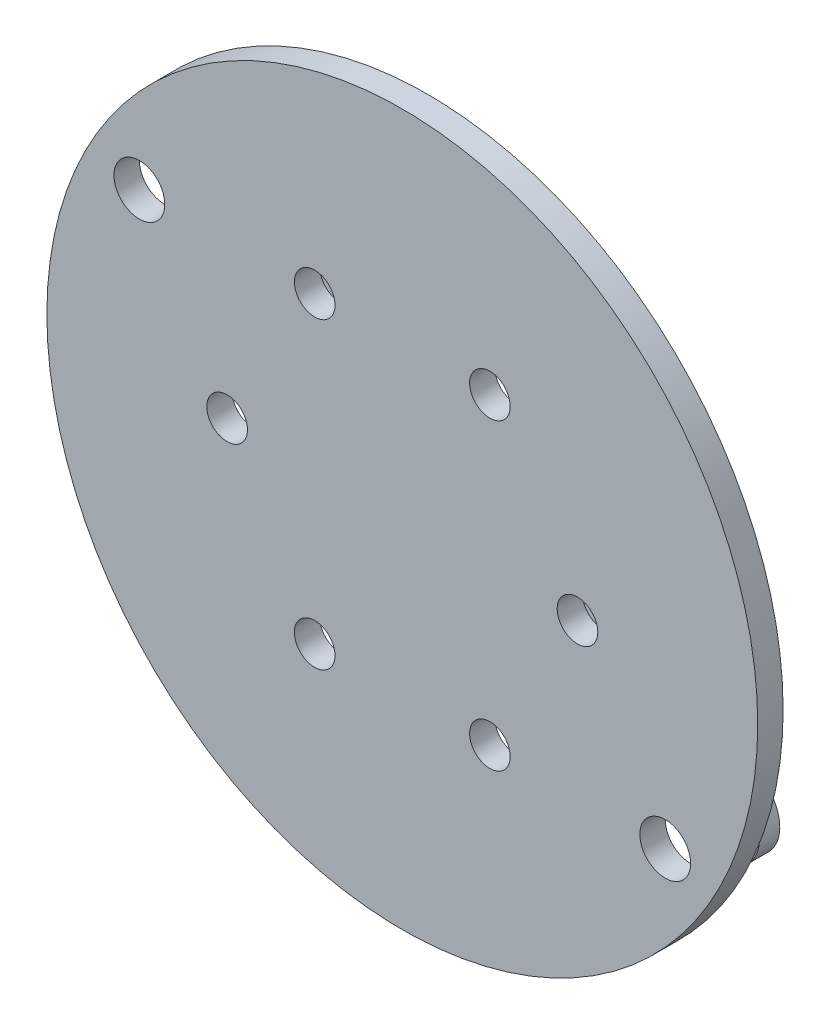
ISO-10303-21;
HEADER;
FILE_DESCRIPTION(('STEP AP214'),'2;1');
FILE_NAME('part.step','',(''),(''),'','','');
FILE_SCHEMA(('AUTOMOTIVE_DESIGN { 1 0 10303 214 1 1 1 1 }'));
ENDSEC;
DATA;
#1=APPLICATION_CONTEXT('core data for automotive mechanical design processes');
#2=APPLICATION_PROTOCOL_DEFINITION('international standard','automotive_design',2000,#1);
#3=PRODUCT_CONTEXT('',#1,'mechanical');
#4=PRODUCT('Part','Part','',(#3));
#5=PRODUCT_RELATED_PRODUCT_CATEGORY('part','',(#4));
#6=PRODUCT_DEFINITION_FORMATION('','',#4);
#7=PRODUCT_DEFINITION_CONTEXT('part definition',#1,'design');
#8=PRODUCT_DEFINITION('design','',#6,#7);
#9=PRODUCT_DEFINITION_SHAPE('','',#8);
#10=(LENGTH_UNIT() NAMED_UNIT(*) SI_UNIT(.MILLI.,.METRE.));
#11=(NAMED_UNIT(*) PLANE_ANGLE_UNIT() SI_UNIT($,.RADIAN.));
#12=(NAMED_UNIT(*) SI_UNIT($,.STERADIAN.) SOLID_ANGLE_UNIT());
#13=UNCERTAINTY_MEASURE_WITH_UNIT(LENGTH_MEASURE(1.E-05),#10,'distance_accuracy_value','');
#14=(GEOMETRIC_REPRESENTATION_CONTEXT(3) GLOBAL_UNCERTAINTY_ASSIGNED_CONTEXT((#13)) GLOBAL_UNIT_ASSIGNED_CONTEXT((#10,
#11,#12)) REPRESENTATION_CONTEXT('',''));
#15=CARTESIAN_POINT('',(0.,0.,0.));
#16=DIRECTION('',(0.,0.,1.));
#17=DIRECTION('',(1.,0.,0.));
#18=AXIS2_PLACEMENT_3D('',#15,#16,#17);
#19=CARTESIAN_POINT('',(0.,0.,2.5));
#20=DIRECTION('',(0.,0.,1.));
#21=DIRECTION('',(1.,0.,0.));
#22=AXIS2_PLACEMENT_3D('',#19,#20,#21);
#23=PLANE('',#22);
#24=CARTESIAN_POINT('',(25.8901104302791,-15.1559289358308,2.5));
#25=DIRECTION('',(0.,0.,-1.));
#26=DIRECTION('',(-1.,0.,0.));
#27=AXIS2_PLACEMENT_3D('',#24,#25,#26);
#28=CIRCLE('',#27,2.5);
#29=CARTESIAN_POINT('',(23.3901104302791,-15.1559289358308,2.5));
#30=VERTEX_POINT('',#29);
#31=EDGE_CURVE('E222',#30,#30,#28,.T.);
#32=ORIENTED_EDGE('',*,*,#31,.T.);
#33=EDGE_LOOP('',(#32));
#34=FACE_BOUND('',#33,.T.);
#35=CARTESIAN_POINT('',(-25.8901104302791,15.1559289358308,2.5));
#36=DIRECTION('',(0.,0.,-1.));
#37=DIRECTION('',(-1.,0.,0.));
#38=AXIS2_PLACEMENT_3D('',#35,#36,#37);
#39=CIRCLE('',#38,2.5);
#40=CARTESIAN_POINT('',(-28.3901104302791,15.1559289358308,2.5));
#41=VERTEX_POINT('',#40);
#42=EDGE_CURVE('E237',#41,#41,#39,.T.);
#43=ORIENTED_EDGE('',*,*,#42,.T.);
#44=EDGE_LOOP('',(#43));
#45=FACE_BOUND('',#44,.T.);
#46=CARTESIAN_POINT('',(-8.62499999999986,14.9389382152816,2.5));
#47=DIRECTION('',(0.,0.,1.));
#48=DIRECTION('',(1.,0.,0.));
#49=AXIS2_PLACEMENT_3D('',#46,#47,#48);
#50=CIRCLE('',#49,2.);
#51=CARTESIAN_POINT('',(-6.62499999999986,14.9389382152816,2.5));
#52=VERTEX_POINT('',#51);
#53=EDGE_CURVE('E183',#52,#52,#50,.T.);
#54=ORIENTED_EDGE('',*,*,#53,.F.);
#55=EDGE_LOOP('',(#54));
#56=FACE_BOUND('',#55,.T.);
#57=CARTESIAN_POINT('',(-8.62500000000007,-14.9389382152815,2.5));
#58=DIRECTION('',(0.,0.,1.));
#59=DIRECTION('',(1.,0.,0.));
#60=AXIS2_PLACEMENT_3D('',#57,#58,#59);
#61=CIRCLE('',#60,2.);
#62=CARTESIAN_POINT('',(-6.62500000000007,-14.9389382152815,2.5));
#63=VERTEX_POINT('',#62);
#64=EDGE_CURVE('E195',#63,#63,#61,.T.);
#65=ORIENTED_EDGE('',*,*,#64,.F.);
#66=EDGE_LOOP('',(#65));
#67=FACE_BOUND('',#66,.T.);
#68=CARTESIAN_POINT('',(17.25,0.,2.5));
#69=DIRECTION('',(0.,0.,1.));
#70=DIRECTION('',(1.,0.,0.));
#71=AXIS2_PLACEMENT_3D('',#68,#69,#70);
#72=CIRCLE('',#71,2.);
#73=CARTESIAN_POINT('',(19.25,0.,2.5));
#74=VERTEX_POINT('',#73);
#75=EDGE_CURVE('E207',#74,#74,#72,.T.);
#76=ORIENTED_EDGE('',*,*,#75,.F.);
#77=EDGE_LOOP('',(#76));
#78=FACE_BOUND('',#77,.T.);
#79=CARTESIAN_POINT('',(0.,0.,2.5));
#80=DIRECTION('',(0.,0.,1.));
#81=DIRECTION('',(1.,0.,0.));
#82=AXIS2_PLACEMENT_3D('',#79,#80,#81);
#83=CIRCLE('',#82,35.);
#84=CARTESIAN_POINT('',(35.,0.,2.5));
#85=VERTEX_POINT('',#84);
#86=EDGE_CURVE('E213',#85,#85,#83,.T.);
#87=ORIENTED_EDGE('',*,*,#86,.T.);
#88=EDGE_LOOP('',(#87));
#89=FACE_BOUND('',#88,.T.);
#90=CARTESIAN_POINT('',(8.62499999999997,-14.9389382152816,2.5));
#91=DIRECTION('',(0.,0.,1.));
#92=DIRECTION('',(1.,0.,0.));
#93=AXIS2_PLACEMENT_3D('',#90,#91,#92);
#94=CIRCLE('',#93,2.);
#95=CARTESIAN_POINT('',(10.625,-14.9389382152816,2.5));
#96=VERTEX_POINT('',#95);
#97=EDGE_CURVE('E201',#96,#96,#94,.T.);
#98=ORIENTED_EDGE('',*,*,#97,.F.);
#99=EDGE_LOOP('',(#98));
#100=FACE_BOUND('',#99,.T.);
#101=CARTESIAN_POINT('',(-17.25,1.20456106190088E-13,2.5));
#102=DIRECTION('',(0.,0.,1.));
#103=DIRECTION('',(1.,0.,0.));
#104=AXIS2_PLACEMENT_3D('',#101,#102,#103);
#105=CIRCLE('',#104,2.);
#106=CARTESIAN_POINT('',(-15.25,1.20456106190088E-13,2.5));
#107=VERTEX_POINT('',#106);
#108=EDGE_CURVE('E189',#107,#107,#105,.T.);
#109=ORIENTED_EDGE('',*,*,#108,.F.);
#110=EDGE_LOOP('',(#109));
#111=FACE_BOUND('',#110,.T.);
#112=CARTESIAN_POINT('',(8.62500000000018,14.9389382152815,2.5));
#113=DIRECTION('',(0.,0.,1.));
#114=DIRECTION('',(1.,0.,0.));
#115=AXIS2_PLACEMENT_3D('',#112,#113,#114);
#116=CIRCLE('',#115,2.);
#117=CARTESIAN_POINT('',(10.6250000000002,14.9389382152815,2.5));
#118=VERTEX_POINT('',#117);
#119=EDGE_CURVE('E177',#118,#118,#116,.T.);
#120=ORIENTED_EDGE('',*,*,#119,.F.);
#121=EDGE_LOOP('',(#120));
#122=FACE_BOUND('',#121,.T.);
#123=ADVANCED_FACE('F43',(#34,#45,#56,#67,#78,#89,#100,#111,#122),#23,.T.);
#124=CARTESIAN_POINT('',(0.,0.,0.));
#125=DIRECTION('',(0.,0.,1.));
#126=DIRECTION('',(1.,0.,0.));
#127=AXIS2_PLACEMENT_3D('',#124,#125,#126);
#128=PLANE('',#127);
#129=CARTESIAN_POINT('',(25.8901104302791,-15.1559289358308,0.));
#130=DIRECTION('',(0.,0.,1.));
#131=DIRECTION('',(1.,0.,0.));
#132=AXIS2_PLACEMENT_3D('',#129,#130,#131);
#133=CIRCLE('',#132,2.5);
#134=CARTESIAN_POINT('',(28.3901104302791,-15.1559289358308,0.));
#135=VERTEX_POINT('',#134);
#136=EDGE_CURVE('E137',#135,#135,#133,.T.);
#137=ORIENTED_EDGE('',*,*,#136,.T.);
#138=EDGE_LOOP('',(#137));
#139=FACE_BOUND('',#138,.T.);
#140=CARTESIAN_POINT('',(-25.8901104302791,15.1559289358308,0.));
#141=DIRECTION('',(0.,0.,1.));
#142=DIRECTION('',(1.,0.,0.));
#143=AXIS2_PLACEMENT_3D('',#140,#141,#142);
#144=CIRCLE('',#143,2.5);
#145=CARTESIAN_POINT('',(-23.3901104302791,15.1559289358308,0.));
#146=VERTEX_POINT('',#145);
#147=EDGE_CURVE('E221',#146,#146,#144,.T.);
#148=ORIENTED_EDGE('',*,*,#147,.T.);
#149=EDGE_LOOP('',(#148));
#150=FACE_BOUND('',#149,.T.);
#151=CARTESIAN_POINT('',(0.,0.,0.));
#152=DIRECTION('',(0.,0.,1.));
#153=DIRECTION('',(1.,0.,0.));
#154=AXIS2_PLACEMENT_3D('',#151,#152,#153);
#155=CIRCLE('',#154,5.);
#156=CARTESIAN_POINT('',(5.,0.,0.));
#157=VERTEX_POINT('',#156);
#158=EDGE_CURVE('E52',#157,#157,#155,.F.);
#159=ORIENTED_EDGE('',*,*,#158,.F.);
#160=EDGE_LOOP('',(#159));
#161=FACE_BOUND('',#160,.T.);
#162=CARTESIAN_POINT('',(0.,0.,0.));
#163=DIRECTION('',(0.,0.,1.));
#164=DIRECTION('',(1.,0.,0.));
#165=AXIS2_PLACEMENT_3D('',#162,#163,#164);
#166=CIRCLE('',#165,35.);
#167=CARTESIAN_POINT('',(35.,0.,0.));
#168=VERTEX_POINT('',#167);
#169=EDGE_CURVE('E210',#168,#168,#166,.T.);
#170=ORIENTED_EDGE('',*,*,#169,.F.);
#171=EDGE_LOOP('',(#170));
#172=FACE_BOUND('',#171,.T.);
#173=CARTESIAN_POINT('',(17.25,0.,0.));
#174=DIRECTION('',(0.,0.,1.));
#175=DIRECTION('',(1.,0.,0.));
#176=AXIS2_PLACEMENT_3D('',#173,#174,#175);
#177=CIRCLE('',#176,2.);
#178=CARTESIAN_POINT('',(19.25,0.,0.));
#179=VERTEX_POINT('',#178);
#180=EDGE_CURVE('E204',#179,#179,#177,.T.);
#181=ORIENTED_EDGE('',*,*,#180,.T.);
#182=EDGE_LOOP('',(#181));
#183=FACE_BOUND('',#182,.T.);
#184=CARTESIAN_POINT('',(8.62499999999997,-14.9389382152816,0.));
#185=DIRECTION('',(0.,0.,1.));
#186=DIRECTION('',(1.,0.,0.));
#187=AXIS2_PLACEMENT_3D('',#184,#185,#186);
#188=CIRCLE('',#187,2.);
#189=CARTESIAN_POINT('',(10.625,-14.9389382152816,0.));
#190=VERTEX_POINT('',#189);
#191=EDGE_CURVE('E198',#190,#190,#188,.T.);
#192=ORIENTED_EDGE('',*,*,#191,.T.);
#193=EDGE_LOOP('',(#192));
#194=FACE_BOUND('',#193,.T.);
#195=CARTESIAN_POINT('',(-8.62500000000007,-14.9389382152815,0.));
#196=DIRECTION('',(0.,0.,1.));
#197=DIRECTION('',(1.,0.,0.));
#198=AXIS2_PLACEMENT_3D('',#195,#196,#197);
#199=CIRCLE('',#198,2.);
#200=CARTESIAN_POINT('',(-6.62500000000007,-14.9389382152815,0.));
#201=VERTEX_POINT('',#200);
#202=EDGE_CURVE('E192',#201,#201,#199,.T.);
#203=ORIENTED_EDGE('',*,*,#202,.T.);
#204=EDGE_LOOP('',(#203));
#205=FACE_BOUND('',#204,.T.);
#206=CARTESIAN_POINT('',(-17.25,1.20456106190088E-13,0.));
#207=DIRECTION('',(0.,0.,1.));
#208=DIRECTION('',(1.,0.,0.));
#209=AXIS2_PLACEMENT_3D('',#206,#207,#208);
#210=CIRCLE('',#209,2.);
#211=CARTESIAN_POINT('',(-15.25,1.20456106190088E-13,0.));
#212=VERTEX_POINT('',#211);
#213=EDGE_CURVE('E186',#212,#212,#210,.T.);
#214=ORIENTED_EDGE('',*,*,#213,.T.);
#215=EDGE_LOOP('',(#214));
#216=FACE_BOUND('',#215,.T.);
#217=CARTESIAN_POINT('',(-8.62499999999986,14.9389382152816,0.));
#218=DIRECTION('',(0.,0.,1.));
#219=DIRECTION('',(1.,0.,0.));
#220=AXIS2_PLACEMENT_3D('',#217,#218,#219);
#221=CIRCLE('',#220,2.);
#222=CARTESIAN_POINT('',(-6.62499999999986,14.9389382152816,0.));
#223=VERTEX_POINT('',#222);
#224=EDGE_CURVE('E180',#223,#223,#221,.T.);
#225=ORIENTED_EDGE('',*,*,#224,.T.);
#226=EDGE_LOOP('',(#225));
#227=FACE_BOUND('',#226,.T.);
#228=CARTESIAN_POINT('',(8.62500000000018,14.9389382152815,0.));
#229=DIRECTION('',(0.,0.,1.));
#230=DIRECTION('',(1.,0.,0.));
#231=AXIS2_PLACEMENT_3D('',#228,#229,#230);
#232=CIRCLE('',#231,2.);
#233=CARTESIAN_POINT('',(10.6250000000002,14.9389382152815,0.));
#234=VERTEX_POINT('',#233);
#235=EDGE_CURVE('E176',#234,#234,#232,.T.);
#236=ORIENTED_EDGE('',*,*,#235,.T.);
#237=EDGE_LOOP('',(#236));
#238=FACE_BOUND('',#237,.T.);
#239=ADVANCED_FACE('F252',(#139,#150,#161,#172,#183,#194,#205,#216,#227,#238),#128,.F.);
#240=CARTESIAN_POINT('',(0.,0.,2.5));
#241=DIRECTION('',(0.,0.,-1.));
#242=DIRECTION('',(-1.,0.,0.));
#243=AXIS2_PLACEMENT_3D('',#240,#241,#242);
#244=CYLINDRICAL_SURFACE('',#243,35.);
#245=ORIENTED_EDGE('',*,*,#86,.F.);
#246=EDGE_LOOP('',(#245));
#247=FACE_BOUND('',#246,.T.);
#248=ORIENTED_EDGE('',*,*,#169,.T.);
#249=EDGE_LOOP('',(#248));
#250=FACE_BOUND('',#249,.T.);
#251=ADVANCED_FACE('F45',(#247,#250),#244,.T.);
#252=CARTESIAN_POINT('',(17.25,0.,2.5));
#253=DIRECTION('',(0.,0.,-1.));
#254=DIRECTION('',(-1.,0.,0.));
#255=AXIS2_PLACEMENT_3D('',#252,#253,#254);
#256=CYLINDRICAL_SURFACE('',#255,2.);
#257=ORIENTED_EDGE('',*,*,#75,.T.);
#258=EDGE_LOOP('',(#257));
#259=FACE_BOUND('',#258,.T.);
#260=ORIENTED_EDGE('',*,*,#180,.F.);
#261=EDGE_LOOP('',(#260));
#262=FACE_BOUND('',#261,.T.);
#263=ADVANCED_FACE('F295',(#259,#262),#256,.F.);
#264=CARTESIAN_POINT('',(8.62499999999997,-14.9389382152816,2.5));
#265=DIRECTION('',(0.,0.,-1.));
#266=DIRECTION('',(-1.,0.,0.));
#267=AXIS2_PLACEMENT_3D('',#264,#265,#266);
#268=CYLINDRICAL_SURFACE('',#267,2.);
#269=ORIENTED_EDGE('',*,*,#97,.T.);
#270=EDGE_LOOP('',(#269));
#271=FACE_BOUND('',#270,.T.);
#272=ORIENTED_EDGE('',*,*,#191,.F.);
#273=EDGE_LOOP('',(#272));
#274=FACE_BOUND('',#273,.T.);
#275=ADVANCED_FACE('F298',(#271,#274),#268,.F.);
#276=CARTESIAN_POINT('',(-8.62500000000007,-14.9389382152815,2.5));
#277=DIRECTION('',(0.,0.,-1.));
#278=DIRECTION('',(-1.,0.,0.));
#279=AXIS2_PLACEMENT_3D('',#276,#277,#278);
#280=CYLINDRICAL_SURFACE('',#279,2.);
#281=ORIENTED_EDGE('',*,*,#64,.T.);
#282=EDGE_LOOP('',(#281));
#283=FACE_BOUND('',#282,.T.);
#284=ORIENTED_EDGE('',*,*,#202,.F.);
#285=EDGE_LOOP('',(#284));
#286=FACE_BOUND('',#285,.T.);
#287=ADVANCED_FACE('F302',(#283,#286),#280,.F.);
#288=CARTESIAN_POINT('',(-17.25,1.20456106190088E-13,2.5));
#289=DIRECTION('',(0.,0.,-1.));
#290=DIRECTION('',(-1.,0.,0.));
#291=AXIS2_PLACEMENT_3D('',#288,#289,#290);
#292=CYLINDRICAL_SURFACE('',#291,2.);
#293=ORIENTED_EDGE('',*,*,#108,.T.);
#294=EDGE_LOOP('',(#293));
#295=FACE_BOUND('',#294,.T.);
#296=ORIENTED_EDGE('',*,*,#213,.F.);
#297=EDGE_LOOP('',(#296));
#298=FACE_BOUND('',#297,.T.);
#299=ADVANCED_FACE('F286',(#295,#298),#292,.F.);
#300=CARTESIAN_POINT('',(-8.62499999999986,14.9389382152816,2.5));
#301=DIRECTION('',(0.,0.,-1.));
#302=DIRECTION('',(-1.,0.,0.));
#303=AXIS2_PLACEMENT_3D('',#300,#301,#302);
#304=CYLINDRICAL_SURFACE('',#303,2.);
#305=ORIENTED_EDGE('',*,*,#53,.T.);
#306=EDGE_LOOP('',(#305));
#307=FACE_BOUND('',#306,.T.);
#308=ORIENTED_EDGE('',*,*,#224,.F.);
#309=EDGE_LOOP('',(#308));
#310=FACE_BOUND('',#309,.T.);
#311=ADVANCED_FACE('F275',(#307,#310),#304,.F.);
#312=CARTESIAN_POINT('',(8.62500000000018,14.9389382152815,2.5));
#313=DIRECTION('',(0.,0.,-1.));
#314=DIRECTION('',(-1.,0.,0.));
#315=AXIS2_PLACEMENT_3D('',#312,#313,#314);
#316=CYLINDRICAL_SURFACE('',#315,2.);
#317=ORIENTED_EDGE('',*,*,#119,.T.);
#318=EDGE_LOOP('',(#317));
#319=FACE_BOUND('',#318,.T.);
#320=ORIENTED_EDGE('',*,*,#235,.F.);
#321=EDGE_LOOP('',(#320));
#322=FACE_BOUND('',#321,.T.);
#323=ADVANCED_FACE('F272',(#319,#322),#316,.F.);
#324=CARTESIAN_POINT('',(0.,0.,-5.));
#325=DIRECTION('',(0.,0.,1.));
#326=DIRECTION('',(1.,0.,0.));
#327=AXIS2_PLACEMENT_3D('',#324,#325,#326);
#328=CYLINDRICAL_SURFACE('',#327,5.);
#329=CARTESIAN_POINT('',(0.,0.,-3.));
#330=DIRECTION('',(0.,0.,-1.));
#331=DIRECTION('',(-1.,0.,0.));
#332=AXIS2_PLACEMENT_3D('',#329,#330,#331);
#333=CIRCLE('',#332,5.);
#334=CARTESIAN_POINT('',(-4.74860751758376,-1.56547968493588,-3.));
#335=VERTEX_POINT('',#334);
#336=CARTESIAN_POINT('',(-0.959625283626066,4.90704792263389,-3.));
#337=VERTEX_POINT('',#336);
#338=EDGE_CURVE('E120',#335,#337,#333,.T.);
#339=ORIENTED_EDGE('',*,*,#338,.F.);
#340=DIRECTION('',(0.,0.,-1.));
#341=VECTOR('',#340,1.);
#342=CARTESIAN_POINT('',(-4.74860751758376,-1.56547968493588,-3.));
#343=LINE('',#342,#341);
#344=CARTESIAN_POINT('',(-4.74860751758376,-1.56547968493588,-5.));
#345=VERTEX_POINT('',#344);
#346=EDGE_CURVE('E133',#335,#345,#343,.T.);
#347=ORIENTED_EDGE('',*,*,#346,.T.);
#348=CARTESIAN_POINT('',(0.,0.,-5.));
#349=DIRECTION('',(0.,0.,-1.));
#350=DIRECTION('',(-1.,0.,0.));
#351=AXIS2_PLACEMENT_3D('',#348,#349,#350);
#352=CIRCLE('',#351,5.);
#353=CARTESIAN_POINT('',(0.911566545685151,-4.91620244017551,-5.));
#354=VERTEX_POINT('',#353);
#355=EDGE_CURVE('E174',#354,#345,#352,.T.);
#356=ORIENTED_EDGE('',*,*,#355,.F.);
#357=DIRECTION('',(0.,0.,1.));
#358=VECTOR('',#357,1.);
#359=CARTESIAN_POINT('',(0.911566545685152,-4.91620244017551,-5.));
#360=LINE('',#359,#358);
#361=CARTESIAN_POINT('',(0.911566545685152,-4.91620244017551,-3.));
#362=VERTEX_POINT('',#361);
#363=EDGE_CURVE('E170',#354,#362,#360,.T.);
#364=ORIENTED_EDGE('',*,*,#363,.T.);
#365=CARTESIAN_POINT('',(0.,0.,-3.));
#366=DIRECTION('',(0.,0.,-1.));
#367=DIRECTION('',(-1.,0.,0.));
#368=AXIS2_PLACEMENT_3D('',#365,#366,#367);
#369=CIRCLE('',#368,5.);
#370=CARTESIAN_POINT('',(4.73306283733709,1.61186729534989,-3.));
#371=VERTEX_POINT('',#370);
#372=EDGE_CURVE('E11',#371,#362,#369,.T.);
#373=ORIENTED_EDGE('',*,*,#372,.F.);
#374=DIRECTION('',(0.,0.,1.));
#375=VECTOR('',#374,1.);
#376=CARTESIAN_POINT('',(4.73306283733709,1.61186729534989,-5.));
#377=LINE('',#376,#375);
#378=CARTESIAN_POINT('',(4.73306283733709,1.61186729534989,-5.));
#379=VERTEX_POINT('',#378);
#380=EDGE_CURVE('E165',#371,#379,#377,.F.);
#381=ORIENTED_EDGE('',*,*,#380,.T.);
#382=CARTESIAN_POINT('',(-0.959625283626066,4.90704792263389,-5.));
#383=VERTEX_POINT('',#382);
#384=EDGE_CURVE('E173',#383,#379,#352,.T.);
#385=ORIENTED_EDGE('',*,*,#384,.F.);
#386=DIRECTION('',(0.,0.,-1.));
#387=VECTOR('',#386,1.);
#388=CARTESIAN_POINT('',(-0.959625283626066,4.90704792263389,-3.));
#389=LINE('',#388,#387);
#390=EDGE_CURVE('E147',#337,#383,#389,.T.);
#391=ORIENTED_EDGE('',*,*,#390,.F.);
#392=EDGE_LOOP('',(#339,#347,#356,#364,#373,#381,#385,#391));
#393=FACE_BOUND('',#392,.T.);
#394=ORIENTED_EDGE('',*,*,#158,.T.);
#395=EDGE_LOOP('',(#394));
#396=FACE_BOUND('',#395,.T.);
#397=ADVANCED_FACE('F274',(#393,#396),#328,.T.);
#398=CARTESIAN_POINT('',(0.,0.,-5.));
#399=DIRECTION('',(0.,0.,-1.));
#400=DIRECTION('',(-1.,0.,0.));
#401=AXIS2_PLACEMENT_3D('',#398,#399,#400);
#402=PLANE('',#401);
#403=CARTESIAN_POINT('',(25.8901104302791,-15.1559289358308,-5.));
#404=DIRECTION('',(0.,0.,-1.));
#405=DIRECTION('',(-1.,0.,0.));
#406=AXIS2_PLACEMENT_3D('',#403,#404,#405);
#407=CIRCLE('',#406,2.5);
#408=CARTESIAN_POINT('',(23.3901104302791,-15.1559289358308,-5.));
#409=VERTEX_POINT('',#408);
#410=EDGE_CURVE('E227',#409,#409,#407,.T.);
#411=ORIENTED_EDGE('',*,*,#410,.F.);
#412=EDGE_LOOP('',(#411));
#413=FACE_BOUND('',#412,.T.);
#414=CARTESIAN_POINT('',(-25.8901104302791,15.1559289358308,-5.));
#415=DIRECTION('',(0.,0.,-1.));
#416=DIRECTION('',(-1.,0.,0.));
#417=AXIS2_PLACEMENT_3D('',#414,#415,#416);
#418=CIRCLE('',#417,2.5);
#419=CARTESIAN_POINT('',(-28.3901104302791,15.1559289358308,-5.));
#420=VERTEX_POINT('',#419);
#421=EDGE_CURVE('E232',#420,#420,#418,.T.);
#422=ORIENTED_EDGE('',*,*,#421,.F.);
#423=EDGE_LOOP('',(#422));
#424=FACE_BOUND('',#423,.T.);
#425=ORIENTED_EDGE('',*,*,#355,.T.);
#426=DIRECTION('',(-0.863003681009304,0.50519763119436,0.));
#427=VECTOR('',#426,1.);
#428=CARTESIAN_POINT('',(-1.89449111697885,-3.23626380378489,-5.));
#429=LINE('',#428,#427);
#430=CARTESIAN_POINT('',(-27.784601547258,11.9196651320459,-5.));
#431=VERTEX_POINT('',#430);
#432=EDGE_CURVE('E142',#345,#431,#429,.T.);
#433=ORIENTED_EDGE('',*,*,#432,.T.);
#434=CARTESIAN_POINT('',(-25.8901104302791,15.1559289358308,-5.));
#435=DIRECTION('',(0.,0.,-1.));
#436=DIRECTION('',(-1.,0.,0.));
#437=AXIS2_PLACEMENT_3D('',#434,#435,#436);
#438=CIRCLE('',#437,3.75);
#439=CARTESIAN_POINT('',(-23.9956193133003,18.3921927396157,-5.));
#440=VERTEX_POINT('',#439);
#441=EDGE_CURVE('E115',#431,#440,#438,.T.);
#442=ORIENTED_EDGE('',*,*,#441,.T.);
#443=DIRECTION('',(-0.863003681009304,0.50519763119436,0.));
#444=VECTOR('',#443,1.);
#445=CARTESIAN_POINT('',(1.89449111697885,3.23626380378489,-5.));
#446=LINE('',#445,#444);
#447=EDGE_CURVE('E60',#383,#440,#446,.T.);
#448=ORIENTED_EDGE('',*,*,#447,.F.);
#449=ORIENTED_EDGE('',*,*,#384,.T.);
#450=DIRECTION('',(0.863003681009304,-0.50519763119436,0.));
#451=VECTOR('',#450,1.);
#452=CARTESIAN_POINT('',(1.91074814582597,3.2640348677627,-5.));
#453=LINE('',#452,#451);
#454=CARTESIAN_POINT('',(27.8008585761051,-11.8918940680681,-5.));
#455=VERTEX_POINT('',#454);
#456=EDGE_CURVE('E146',#379,#455,#453,.T.);
#457=ORIENTED_EDGE('',*,*,#456,.T.);
#458=CARTESIAN_POINT('',(25.8901104302791,-15.1559289358308,-5.));
#459=DIRECTION('',(0.,0.,-1.));
#460=DIRECTION('',(-1.,0.,0.));
#461=AXIS2_PLACEMENT_3D('',#458,#459,#460);
#462=CIRCLE('',#461,3.78217954290222);
#463=CARTESIAN_POINT('',(23.9793622844531,-18.4199638035935,-5.));
#464=VERTEX_POINT('',#463);
#465=EDGE_CURVE('E160',#455,#464,#462,.T.);
#466=ORIENTED_EDGE('',*,*,#465,.T.);
#467=DIRECTION('',(-0.863003681009304,0.50519763119436,0.));
#468=VECTOR('',#467,1.);
#469=CARTESIAN_POINT('',(-1.91074814582597,-3.2640348677627,-5.));
#470=LINE('',#469,#468);
#471=EDGE_CURVE('E67',#464,#354,#470,.T.);
#472=ORIENTED_EDGE('',*,*,#471,.T.);
#473=EDGE_LOOP('',(#425,#433,#442,#448,#449,#457,#466,#472));
#474=FACE_BOUND('',#473,.T.);
#475=ADVANCED_FACE('F283',(#413,#424,#474),#402,.T.);
#476=CARTESIAN_POINT('',(-1.91074814582597,-3.2640348677627,-3.));
#477=DIRECTION('',(-0.50519763119436,-0.863003681009304,0.));
#478=DIRECTION('',(0.863003681009304,-0.50519763119436,0.));
#479=AXIS2_PLACEMENT_3D('',#476,#477,#478);
#480=PLANE('',#479);
#481=ORIENTED_EDGE('',*,*,#363,.F.);
#482=ORIENTED_EDGE('',*,*,#471,.F.);
#483=DIRECTION('',(0.,0.,-1.));
#484=VECTOR('',#483,1.);
#485=CARTESIAN_POINT('',(23.9793622844531,-18.4199638035935,-3.));
#486=LINE('',#485,#484);
#487=CARTESIAN_POINT('',(23.9793622844531,-18.4199638035935,-3.));
#488=VERTEX_POINT('',#487);
#489=EDGE_CURVE('E163',#488,#464,#486,.T.);
#490=ORIENTED_EDGE('',*,*,#489,.F.);
#491=DIRECTION('',(-0.863003681009304,0.50519763119436,0.));
#492=VECTOR('',#491,1.);
#493=CARTESIAN_POINT('',(-1.91074814582597,-3.2640348677627,-3.));
#494=LINE('',#493,#492);
#495=EDGE_CURVE('E155',#488,#362,#494,.T.);
#496=ORIENTED_EDGE('',*,*,#495,.T.);
#497=EDGE_LOOP('',(#481,#482,#490,#496));
#498=FACE_BOUND('',#497,.T.);
#499=ADVANCED_FACE('F345',(#498),#480,.T.);
#500=CARTESIAN_POINT('',(1.91074814582597,3.2640348677627,-3.));
#501=DIRECTION('',(0.50519763119436,0.863003681009304,0.));
#502=DIRECTION('',(-0.863003681009304,0.50519763119436,0.));
#503=AXIS2_PLACEMENT_3D('',#500,#501,#502);
#504=PLANE('',#503);
#505=ORIENTED_EDGE('',*,*,#380,.F.);
#506=DIRECTION('',(0.863003681009304,-0.50519763119436,0.));
#507=VECTOR('',#506,1.);
#508=CARTESIAN_POINT('',(1.91074814582597,3.2640348677627,-3.));
#509=LINE('',#508,#507);
#510=CARTESIAN_POINT('',(27.8008585761051,-11.8918940680681,-3.));
#511=VERTEX_POINT('',#510);
#512=EDGE_CURVE('E150',#371,#511,#509,.T.);
#513=ORIENTED_EDGE('',*,*,#512,.T.);
#514=DIRECTION('',(0.,0.,-1.));
#515=VECTOR('',#514,1.);
#516=CARTESIAN_POINT('',(27.8008585761051,-11.8918940680681,-3.));
#517=LINE('',#516,#515);
#518=EDGE_CURVE('E158',#511,#455,#517,.T.);
#519=ORIENTED_EDGE('',*,*,#518,.T.);
#520=ORIENTED_EDGE('',*,*,#456,.F.);
#521=EDGE_LOOP('',(#505,#513,#519,#520));
#522=FACE_BOUND('',#521,.T.);
#523=ADVANCED_FACE('F361',(#522),#504,.T.);
#524=CARTESIAN_POINT('',(25.8901104302791,-15.1559289358308,-3.));
#525=DIRECTION('',(0.,0.,-1.));
#526=DIRECTION('',(-1.,0.,0.));
#527=AXIS2_PLACEMENT_3D('',#524,#525,#526);
#528=CYLINDRICAL_SURFACE('',#527,3.78217954290222);
#529=ORIENTED_EDGE('',*,*,#465,.F.);
#530=ORIENTED_EDGE('',*,*,#518,.F.);
#531=CARTESIAN_POINT('',(25.8901104302791,-15.1559289358308,-3.));
#532=DIRECTION('',(0.,0.,-1.));
#533=DIRECTION('',(-1.,0.,0.));
#534=AXIS2_PLACEMENT_3D('',#531,#532,#533);
#535=CIRCLE('',#534,3.78217954290222);
#536=EDGE_CURVE('E152',#511,#488,#535,.T.);
#537=ORIENTED_EDGE('',*,*,#536,.T.);
#538=ORIENTED_EDGE('',*,*,#489,.T.);
#539=EDGE_LOOP('',(#529,#530,#537,#538));
#540=FACE_BOUND('',#539,.T.);
#541=ADVANCED_FACE('F371',(#540),#528,.T.);
#542=CARTESIAN_POINT('',(0.,0.,-3.));
#543=DIRECTION('',(0.,0.,-1.));
#544=DIRECTION('',(-1.,0.,0.));
#545=AXIS2_PLACEMENT_3D('',#542,#543,#544);
#546=PLANE('',#545);
#547=CARTESIAN_POINT('',(25.8901104302791,-15.1559289358308,-3.));
#548=DIRECTION('',(0.,0.,-1.));
#549=DIRECTION('',(-1.,0.,0.));
#550=AXIS2_PLACEMENT_3D('',#547,#548,#549);
#551=CIRCLE('',#550,2.5);
#552=CARTESIAN_POINT('',(23.3901104302791,-15.1559289358308,-3.));
#553=VERTEX_POINT('',#552);
#554=EDGE_CURVE('E47',#553,#553,#551,.T.);
#555=ORIENTED_EDGE('',*,*,#554,.T.);
#556=EDGE_LOOP('',(#555));
#557=FACE_BOUND('',#556,.T.);
#558=ORIENTED_EDGE('',*,*,#512,.F.);
#559=ORIENTED_EDGE('',*,*,#372,.T.);
#560=ORIENTED_EDGE('',*,*,#495,.F.);
#561=ORIENTED_EDGE('',*,*,#536,.F.);
#562=EDGE_LOOP('',(#558,#559,#560,#561));
#563=FACE_BOUND('',#562,.T.);
#564=ADVANCED_FACE('F379',(#557,#563),#546,.F.);
#565=CARTESIAN_POINT('',(-1.89449111697885,-3.23626380378489,-3.));
#566=DIRECTION('',(-0.50519763119436,-0.863003681009304,0.));
#567=DIRECTION('',(0.863003681009304,-0.50519763119436,0.));
#568=AXIS2_PLACEMENT_3D('',#565,#566,#567);
#569=PLANE('',#568);
#570=ORIENTED_EDGE('',*,*,#432,.F.);
#571=ORIENTED_EDGE('',*,*,#346,.F.);
#572=DIRECTION('',(-0.863003681009304,0.50519763119436,0.));
#573=VECTOR('',#572,1.);
#574=CARTESIAN_POINT('',(-1.89449111697885,-3.23626380378489,-3.));
#575=LINE('',#574,#573);
#576=CARTESIAN_POINT('',(-27.784601547258,11.9196651320459,-3.));
#577=VERTEX_POINT('',#576);
#578=EDGE_CURVE('E125',#335,#577,#575,.T.);
#579=ORIENTED_EDGE('',*,*,#578,.T.);
#580=DIRECTION('',(0.,0.,-1.));
#581=VECTOR('',#580,1.);
#582=CARTESIAN_POINT('',(-27.784601547258,11.9196651320459,-3.));
#583=LINE('',#582,#581);
#584=EDGE_CURVE('E111',#577,#431,#583,.T.);
#585=ORIENTED_EDGE('',*,*,#584,.T.);
#586=EDGE_LOOP('',(#570,#571,#579,#585));
#587=FACE_BOUND('',#586,.T.);
#588=ADVANCED_FACE('F131',(#587),#569,.T.);
#589=CARTESIAN_POINT('',(1.89449111697885,3.23626380378489,-3.));
#590=DIRECTION('',(-0.50519763119436,-0.863003681009303,0.));
#591=DIRECTION('',(0.863003681009303,-0.50519763119436,0.));
#592=AXIS2_PLACEMENT_3D('',#589,#590,#591);
#593=PLANE('',#592);
#594=ORIENTED_EDGE('',*,*,#447,.T.);
#595=DIRECTION('',(0.,0.,-1.));
#596=VECTOR('',#595,1.);
#597=CARTESIAN_POINT('',(-23.9956193133003,18.3921927396157,-3.));
#598=LINE('',#597,#596);
#599=CARTESIAN_POINT('',(-23.9956193133003,18.3921927396157,-3.));
#600=VERTEX_POINT('',#599);
#601=EDGE_CURVE('E119',#600,#440,#598,.T.);
#602=ORIENTED_EDGE('',*,*,#601,.F.);
#603=DIRECTION('',(-0.863003681009304,0.50519763119436,0.));
#604=VECTOR('',#603,1.);
#605=CARTESIAN_POINT('',(1.89449111697885,3.23626380378489,-3.));
#606=LINE('',#605,#604);
#607=EDGE_CURVE('E128',#337,#600,#606,.T.);
#608=ORIENTED_EDGE('',*,*,#607,.F.);
#609=ORIENTED_EDGE('',*,*,#390,.T.);
#610=EDGE_LOOP('',(#594,#602,#608,#609));
#611=FACE_BOUND('',#610,.T.);
#612=ADVANCED_FACE('F437',(#611),#593,.F.);
#613=CARTESIAN_POINT('',(-25.8901104302791,15.1559289358308,-3.));
#614=DIRECTION('',(0.,0.,-1.));
#615=DIRECTION('',(-1.,0.,0.));
#616=AXIS2_PLACEMENT_3D('',#613,#614,#615);
#617=CYLINDRICAL_SURFACE('',#616,3.75);
#618=ORIENTED_EDGE('',*,*,#441,.F.);
#619=ORIENTED_EDGE('',*,*,#584,.F.);
#620=CARTESIAN_POINT('',(-25.8901104302791,15.1559289358308,-3.));
#621=DIRECTION('',(0.,0.,-1.));
#622=DIRECTION('',(-1.,0.,0.));
#623=AXIS2_PLACEMENT_3D('',#620,#621,#622);
#624=CIRCLE('',#623,3.75);
#625=EDGE_CURVE('E114',#577,#600,#624,.T.);
#626=ORIENTED_EDGE('',*,*,#625,.T.);
#627=ORIENTED_EDGE('',*,*,#601,.T.);
#628=EDGE_LOOP('',(#618,#619,#626,#627));
#629=FACE_BOUND('',#628,.T.);
#630=ADVANCED_FACE('F113',(#629),#617,.T.);
#631=CARTESIAN_POINT('',(0.,0.,-3.));
#632=DIRECTION('',(0.,0.,-1.));
#633=DIRECTION('',(-1.,0.,0.));
#634=AXIS2_PLACEMENT_3D('',#631,#632,#633);
#635=PLANE('',#634);
#636=CARTESIAN_POINT('',(-25.8901104302791,15.1559289358308,-3.));
#637=DIRECTION('',(0.,0.,-1.));
#638=DIRECTION('',(-1.,0.,0.));
#639=AXIS2_PLACEMENT_3D('',#636,#637,#638);
#640=CIRCLE('',#639,2.5);
#641=CARTESIAN_POINT('',(-28.3901104302791,15.1559289358308,-3.));
#642=VERTEX_POINT('',#641);
#643=EDGE_CURVE('E219',#642,#642,#640,.T.);
#644=ORIENTED_EDGE('',*,*,#643,.T.);
#645=EDGE_LOOP('',(#644));
#646=FACE_BOUND('',#645,.T.);
#647=ORIENTED_EDGE('',*,*,#578,.F.);
#648=ORIENTED_EDGE('',*,*,#338,.T.);
#649=ORIENTED_EDGE('',*,*,#607,.T.);
#650=ORIENTED_EDGE('',*,*,#625,.F.);
#651=EDGE_LOOP('',(#647,#648,#649,#650));
#652=FACE_BOUND('',#651,.T.);
#653=ADVANCED_FACE('F124',(#646,#652),#635,.F.);
#654=CARTESIAN_POINT('',(-25.8901104302791,15.1559289358308,2.5));
#655=DIRECTION('',(0.,0.,-1.));
#656=DIRECTION('',(-1.,0.,0.));
#657=AXIS2_PLACEMENT_3D('',#654,#655,#656);
#658=CYLINDRICAL_SURFACE('',#657,2.5);
#659=ORIENTED_EDGE('',*,*,#421,.T.);
#660=EDGE_LOOP('',(#659));
#661=FACE_BOUND('',#660,.T.);
#662=ORIENTED_EDGE('',*,*,#643,.F.);
#663=EDGE_LOOP('',(#662));
#664=FACE_BOUND('',#663,.T.);
#665=ADVANCED_FACE('F249',(#661,#664),#658,.F.);
#666=CARTESIAN_POINT('',(25.8901104302791,-15.1559289358308,2.5));
#667=DIRECTION('',(0.,0.,-1.));
#668=DIRECTION('',(-1.,0.,0.));
#669=AXIS2_PLACEMENT_3D('',#666,#667,#668);
#670=CYLINDRICAL_SURFACE('',#669,2.5);
#671=ORIENTED_EDGE('',*,*,#410,.T.);
#672=EDGE_LOOP('',(#671));
#673=FACE_BOUND('',#672,.T.);
#674=ORIENTED_EDGE('',*,*,#554,.F.);
#675=EDGE_LOOP('',(#674));
#676=FACE_BOUND('',#675,.T.);
#677=ADVANCED_FACE('F247',(#673,#676),#670,.F.);
#678=ORIENTED_EDGE('',*,*,#42,.F.);
#679=EDGE_LOOP('',(#678));
#680=FACE_BOUND('',#679,.T.);
#681=ORIENTED_EDGE('',*,*,#147,.F.);
#682=EDGE_LOOP('',(#681));
#683=FACE_BOUND('',#682,.T.);
#684=ADVANCED_FACE('F243',(#680,#683),#658,.F.);
#685=ORIENTED_EDGE('',*,*,#31,.F.);
#686=EDGE_LOOP('',(#685));
#687=FACE_BOUND('',#686,.T.);
#688=ORIENTED_EDGE('',*,*,#136,.F.);
#689=EDGE_LOOP('',(#688));
#690=FACE_BOUND('',#689,.T.);
#691=ADVANCED_FACE('F246',(#687,#690),#670,.F.);
#692=CLOSED_SHELL('',(#123,#239,#251,#263,#275,#287,#299,#311,#323,#397,#475,#499,#523,#541,
#564,#588,#612,#630,#653,#665,#677,#684,#691));
#693=MANIFOLD_SOLID_BREP('B2',#692);
#694=ADVANCED_BREP_SHAPE_REPRESENTATION('',(#18,#693),#14);
#695=SHAPE_DEFINITION_REPRESENTATION(#9,#694);
ENDSEC;
END-ISO-10303-21;
